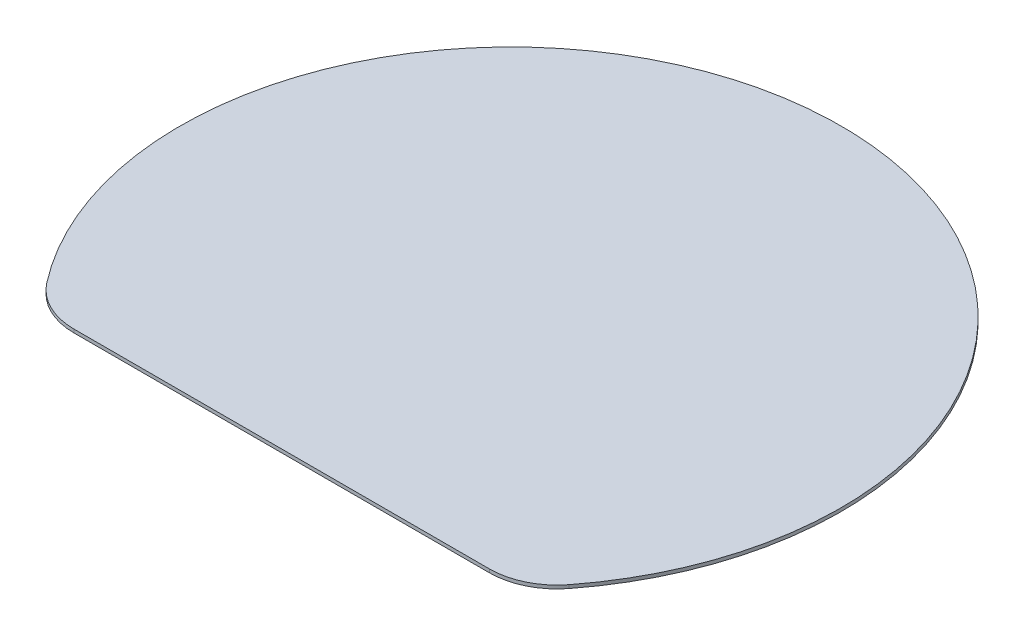
ISO-10303-21;
HEADER;
FILE_DESCRIPTION(('STEP AP214'),'2;1');
FILE_NAME('part.step','',(''),(''),'','','');
FILE_SCHEMA(('AUTOMOTIVE_DESIGN { 1 0 10303 214 1 1 1 1 }'));
ENDSEC;
DATA;
#1=APPLICATION_CONTEXT('core data for automotive mechanical design processes');
#2=APPLICATION_PROTOCOL_DEFINITION('international standard','automotive_design',2000,#1);
#3=PRODUCT_CONTEXT('',#1,'mechanical');
#4=PRODUCT('Part','Part','',(#3));
#5=PRODUCT_RELATED_PRODUCT_CATEGORY('part','',(#4));
#6=PRODUCT_DEFINITION_FORMATION('','',#4);
#7=PRODUCT_DEFINITION_CONTEXT('part definition',#1,'design');
#8=PRODUCT_DEFINITION('design','',#6,#7);
#9=PRODUCT_DEFINITION_SHAPE('','',#8);
#10=(LENGTH_UNIT() NAMED_UNIT(*) SI_UNIT(.MILLI.,.METRE.));
#11=(NAMED_UNIT(*) PLANE_ANGLE_UNIT() SI_UNIT($,.RADIAN.));
#12=(NAMED_UNIT(*) SI_UNIT($,.STERADIAN.) SOLID_ANGLE_UNIT());
#13=UNCERTAINTY_MEASURE_WITH_UNIT(LENGTH_MEASURE(1.E-05),#10,'distance_accuracy_value','');
#14=(GEOMETRIC_REPRESENTATION_CONTEXT(3) GLOBAL_UNCERTAINTY_ASSIGNED_CONTEXT((#13)) GLOBAL_UNIT_ASSIGNED_CONTEXT((#10,
#11,#12)) REPRESENTATION_CONTEXT('',''));
#15=CARTESIAN_POINT('',(0.,0.,0.));
#16=DIRECTION('',(0.,0.,1.));
#17=DIRECTION('',(1.,0.,0.));
#18=AXIS2_PLACEMENT_3D('',#15,#16,#17);
#19=CARTESIAN_POINT('',(0.,2.,0.));
#20=DIRECTION('',(0.,-1.,0.));
#21=DIRECTION('',(0.,0.,-1.));
#22=AXIS2_PLACEMENT_3D('',#19,#20,#21);
#23=CYLINDRICAL_SURFACE('',#22,195.);
#24=CARTESIAN_POINT('',(0.,2.,0.));
#25=DIRECTION('',(0.,1.,0.));
#26=DIRECTION('',(0.,0.,1.));
#27=AXIS2_PLACEMENT_3D('',#24,#25,#26);
#28=CIRCLE('',#27,195.);
#29=CARTESIAN_POINT('',(154.080806400877,2.,119.516129032258));
#30=VERTEX_POINT('',#29);
#31=CARTESIAN_POINT('',(-154.080806400877,2.,119.516129032258));
#32=VERTEX_POINT('',#31);
#33=EDGE_CURVE('E91',#30,#32,#28,.T.);
#34=ORIENTED_EDGE('',*,*,#33,.F.);
#35=DIRECTION('',(0.,-1.,0.));
#36=VECTOR('',#35,1.);
#37=CARTESIAN_POINT('',(154.080806400877,2.,119.516129032258));
#38=LINE('',#37,#36);
#39=CARTESIAN_POINT('',(154.080806400877,0.,119.516129032258));
#40=VERTEX_POINT('',#39);
#41=EDGE_CURVE('E79',#30,#40,#38,.T.);
#42=ORIENTED_EDGE('',*,*,#41,.T.);
#43=CARTESIAN_POINT('',(0.,0.,0.));
#44=DIRECTION('',(0.,1.,0.));
#45=DIRECTION('',(0.,0.,1.));
#46=AXIS2_PLACEMENT_3D('',#43,#44,#45);
#47=CIRCLE('',#46,195.);
#48=CARTESIAN_POINT('',(-154.080806400877,0.,119.516129032258));
#49=VERTEX_POINT('',#48);
#50=EDGE_CURVE('E89',#40,#49,#47,.T.);
#51=ORIENTED_EDGE('',*,*,#50,.T.);
#52=DIRECTION('',(0.,-1.,0.));
#53=VECTOR('',#52,1.);
#54=CARTESIAN_POINT('',(-154.080806400877,2.,119.516129032258));
#55=LINE('',#54,#53);
#56=EDGE_CURVE('E92',#49,#32,#55,.F.);
#57=ORIENTED_EDGE('',*,*,#56,.T.);
#58=EDGE_LOOP('',(#34,#42,#51,#57));
#59=FACE_BOUND('',#58,.T.);
#60=ADVANCED_FACE('F35',(#59),#23,.T.);
#61=CARTESIAN_POINT('',(-140.712472794703,2.,135.));
#62=DIRECTION('',(0.,0.,-1.));
#63=DIRECTION('',(-1.,0.,0.));
#64=AXIS2_PLACEMENT_3D('',#61,#62,#63);
#65=PLANE('',#64);
#66=DIRECTION('',(1.,0.,0.));
#67=VECTOR('',#66,1.);
#68=CARTESIAN_POINT('',(-140.712472794703,0.,135.));
#69=LINE('',#68,#67);
#70=CARTESIAN_POINT('',(-122.474487139159,0.,135.));
#71=VERTEX_POINT('',#70);
#72=CARTESIAN_POINT('',(122.474487139159,0.,135.));
#73=VERTEX_POINT('',#72);
#74=EDGE_CURVE('E95',#71,#73,#69,.T.);
#75=ORIENTED_EDGE('',*,*,#74,.T.);
#76=DIRECTION('',(0.,-1.,0.));
#77=VECTOR('',#76,1.);
#78=CARTESIAN_POINT('',(122.474487139159,2.,135.));
#79=LINE('',#78,#77);
#80=CARTESIAN_POINT('',(122.474487139159,2.,135.));
#81=VERTEX_POINT('',#80);
#82=EDGE_CURVE('E50',#73,#81,#79,.F.);
#83=ORIENTED_EDGE('',*,*,#82,.T.);
#84=DIRECTION('',(1.,0.,0.));
#85=VECTOR('',#84,1.);
#86=CARTESIAN_POINT('',(-140.712472794703,2.,135.));
#87=LINE('',#86,#85);
#88=CARTESIAN_POINT('',(-122.474487139159,2.,135.));
#89=VERTEX_POINT('',#88);
#90=EDGE_CURVE('E99',#89,#81,#87,.T.);
#91=ORIENTED_EDGE('',*,*,#90,.F.);
#92=DIRECTION('',(0.,-1.,0.));
#93=VECTOR('',#92,1.);
#94=CARTESIAN_POINT('',(-122.474487139159,2.,135.));
#95=LINE('',#94,#93);
#96=EDGE_CURVE('E83',#89,#71,#95,.T.);
#97=ORIENTED_EDGE('',*,*,#96,.T.);
#98=EDGE_LOOP('',(#75,#83,#91,#97));
#99=FACE_BOUND('',#98,.T.);
#100=ADVANCED_FACE('F107',(#99),#65,.F.);
#101=CARTESIAN_POINT('',(0.,2.,0.));
#102=DIRECTION('',(0.,1.,0.));
#103=DIRECTION('',(0.,0.,1.));
#104=AXIS2_PLACEMENT_3D('',#101,#102,#103);
#105=PLANE('',#104);
#106=ORIENTED_EDGE('',*,*,#90,.T.);
#107=CARTESIAN_POINT('',(122.474487139159,2.,95.));
#108=DIRECTION('',(0.,1.,0.));
#109=DIRECTION('',(0.,0.,1.));
#110=AXIS2_PLACEMENT_3D('',#107,#108,#109);
#111=CIRCLE('',#110,40.);
#112=EDGE_CURVE('E11',#81,#30,#111,.T.);
#113=ORIENTED_EDGE('',*,*,#112,.T.);
#114=ORIENTED_EDGE('',*,*,#33,.T.);
#115=CARTESIAN_POINT('',(-122.474487139159,2.,95.));
#116=DIRECTION('',(0.,1.,0.));
#117=DIRECTION('',(0.,0.,1.));
#118=AXIS2_PLACEMENT_3D('',#115,#116,#117);
#119=CIRCLE('',#118,40.);
#120=EDGE_CURVE('E43',#32,#89,#119,.T.);
#121=ORIENTED_EDGE('',*,*,#120,.T.);
#122=EDGE_LOOP('',(#106,#113,#114,#121));
#123=FACE_BOUND('',#122,.T.);
#124=ADVANCED_FACE('F109',(#123),#105,.T.);
#125=CARTESIAN_POINT('',(0.,0.,0.));
#126=DIRECTION('',(0.,1.,0.));
#127=DIRECTION('',(0.,0.,1.));
#128=AXIS2_PLACEMENT_3D('',#125,#126,#127);
#129=PLANE('',#128);
#130=ORIENTED_EDGE('',*,*,#50,.F.);
#131=CARTESIAN_POINT('',(122.474487139159,0.,95.));
#132=DIRECTION('',(0.,1.,0.));
#133=DIRECTION('',(0.,0.,1.));
#134=AXIS2_PLACEMENT_3D('',#131,#132,#133);
#135=CIRCLE('',#134,40.);
#136=EDGE_CURVE('E75',#40,#73,#135,.F.);
#137=ORIENTED_EDGE('',*,*,#136,.T.);
#138=ORIENTED_EDGE('',*,*,#74,.F.);
#139=CARTESIAN_POINT('',(-122.474487139159,0.,95.));
#140=DIRECTION('',(0.,1.,0.));
#141=DIRECTION('',(0.,0.,1.));
#142=AXIS2_PLACEMENT_3D('',#139,#140,#141);
#143=CIRCLE('',#142,40.);
#144=EDGE_CURVE('E84',#71,#49,#143,.F.);
#145=ORIENTED_EDGE('',*,*,#144,.T.);
#146=EDGE_LOOP('',(#130,#137,#138,#145));
#147=FACE_BOUND('',#146,.T.);
#148=ADVANCED_FACE('F94',(#147),#129,.F.);
#149=CARTESIAN_POINT('',(122.474487139159,2.,95.));
#150=DIRECTION('',(0.,-1.,0.));
#151=DIRECTION('',(0.,0.,-1.));
#152=AXIS2_PLACEMENT_3D('',#149,#150,#151);
#153=CYLINDRICAL_SURFACE('',#152,40.);
#154=ORIENTED_EDGE('',*,*,#112,.F.);
#155=ORIENTED_EDGE('',*,*,#82,.F.);
#156=ORIENTED_EDGE('',*,*,#136,.F.);
#157=ORIENTED_EDGE('',*,*,#41,.F.);
#158=EDGE_LOOP('',(#154,#155,#156,#157));
#159=FACE_BOUND('',#158,.T.);
#160=ADVANCED_FACE('F78',(#159),#153,.T.);
#161=CARTESIAN_POINT('',(-122.474487139159,2.,95.));
#162=DIRECTION('',(0.,-1.,0.));
#163=DIRECTION('',(0.,0.,-1.));
#164=AXIS2_PLACEMENT_3D('',#161,#162,#163);
#165=CYLINDRICAL_SURFACE('',#164,40.);
#166=ORIENTED_EDGE('',*,*,#120,.F.);
#167=ORIENTED_EDGE('',*,*,#56,.F.);
#168=ORIENTED_EDGE('',*,*,#144,.F.);
#169=ORIENTED_EDGE('',*,*,#96,.F.);
#170=EDGE_LOOP('',(#166,#167,#168,#169));
#171=FACE_BOUND('',#170,.T.);
#172=ADVANCED_FACE('F37',(#171),#165,.T.);
#173=CLOSED_SHELL('',(#60,#100,#124,#148,#160,#172));
#174=MANIFOLD_SOLID_BREP('B2',#173);
#175=ADVANCED_BREP_SHAPE_REPRESENTATION('',(#18,#174),#14);
#176=SHAPE_DEFINITION_REPRESENTATION(#9,#175);
ENDSEC;
END-ISO-10303-21;
